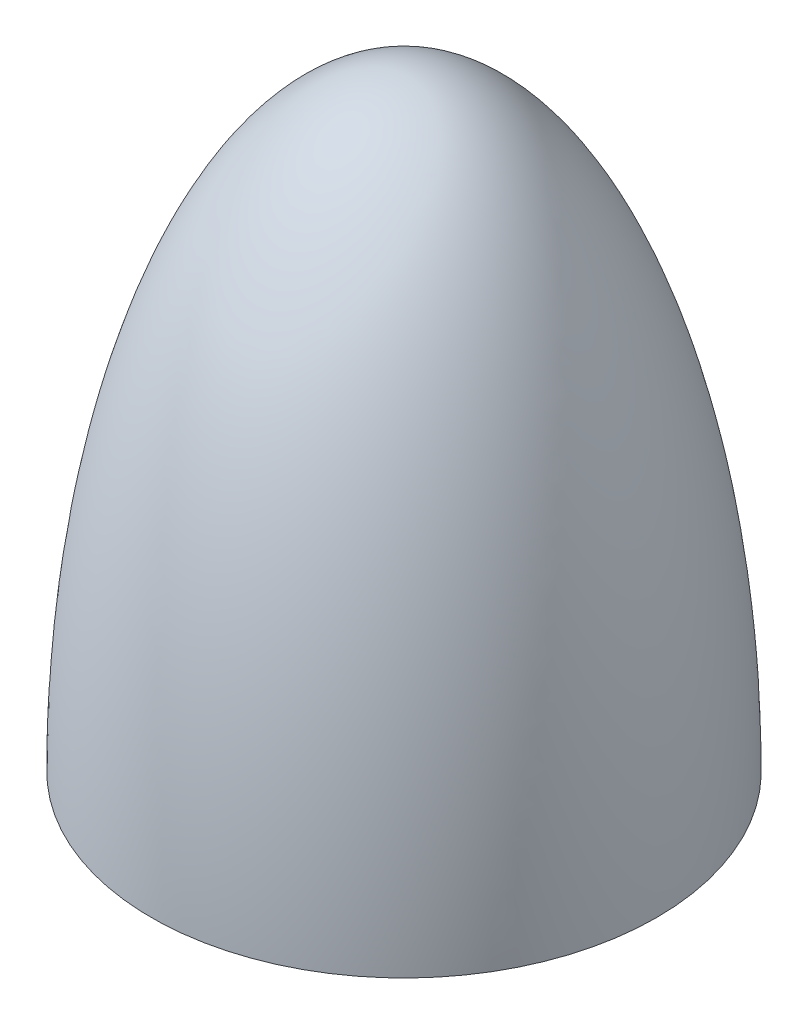
ISO-10303-21;
HEADER;
FILE_DESCRIPTION(('STEP AP214'),'2;1');
FILE_NAME('part.step','',(''),(''),'','','');
FILE_SCHEMA(('AUTOMOTIVE_DESIGN { 1 0 10303 214 1 1 1 1 }'));
ENDSEC;
DATA;
#1=APPLICATION_CONTEXT('core data for automotive mechanical design processes');
#2=APPLICATION_PROTOCOL_DEFINITION('international standard','automotive_design',2000,#1);
#3=PRODUCT_CONTEXT('',#1,'mechanical');
#4=PRODUCT('Part','Part','',(#3));
#5=PRODUCT_RELATED_PRODUCT_CATEGORY('part','',(#4));
#6=PRODUCT_DEFINITION_FORMATION('','',#4);
#7=PRODUCT_DEFINITION_CONTEXT('part definition',#1,'design');
#8=PRODUCT_DEFINITION('design','',#6,#7);
#9=PRODUCT_DEFINITION_SHAPE('','',#8);
#10=(LENGTH_UNIT() NAMED_UNIT(*) SI_UNIT(.MILLI.,.METRE.));
#11=(NAMED_UNIT(*) PLANE_ANGLE_UNIT() SI_UNIT($,.RADIAN.));
#12=(NAMED_UNIT(*) SI_UNIT($,.STERADIAN.) SOLID_ANGLE_UNIT());
#13=UNCERTAINTY_MEASURE_WITH_UNIT(LENGTH_MEASURE(1.E-05),#10,'distance_accuracy_value','');
#14=(GEOMETRIC_REPRESENTATION_CONTEXT(3) GLOBAL_UNCERTAINTY_ASSIGNED_CONTEXT((#13)) GLOBAL_UNIT_ASSIGNED_CONTEXT((#10,
#11,#12)) REPRESENTATION_CONTEXT('',''));
#15=CARTESIAN_POINT('',(0.,0.,0.));
#16=DIRECTION('',(0.,0.,1.));
#17=DIRECTION('',(1.,0.,0.));
#18=AXIS2_PLACEMENT_3D('',#15,#16,#17);
#19=CARTESIAN_POINT('',(0.,0.,0.));
#20=DIRECTION('',(0.,-1.,0.));
#21=DIRECTION('',(1.,0.,0.));
#22=AXIS2_PLACEMENT_3D('',#19,#20,#21);
#23=PLANE('',#22);
#24=CARTESIAN_POINT('',(0.,0.,0.));
#25=DIRECTION('',(0.,-1.,0.));
#26=DIRECTION('',(1.,0.,0.));
#27=AXIS2_PLACEMENT_3D('',#24,#25,#26);
#28=CIRCLE('',#27,60.9);
#29=CARTESIAN_POINT('',(60.9,0.,0.));
#30=VERTEX_POINT('',#29);
#31=EDGE_CURVE('E11',#30,#30,#28,.T.);
#32=ORIENTED_EDGE('',*,*,#31,.T.);
#33=EDGE_LOOP('',(#32));
#34=FACE_BOUND('',#33,.T.);
#35=CARTESIAN_POINT('',(0.,0.,0.));
#36=DIRECTION('',(0.,-1.,0.));
#37=DIRECTION('',(1.,0.,0.));
#38=AXIS2_PLACEMENT_3D('',#35,#36,#37);
#39=CIRCLE('',#38,59.7);
#40=CARTESIAN_POINT('',(59.7,0.,0.));
#41=VERTEX_POINT('',#40);
#42=EDGE_CURVE('E42',#41,#41,#39,.T.);
#43=ORIENTED_EDGE('',*,*,#42,.F.);
#44=EDGE_LOOP('',(#43));
#45=FACE_BOUND('',#44,.T.);
#46=ADVANCED_FACE('F35',(#34,#45),#23,.T.);
#47=CARTESIAN_POINT('',(60.9,0.,0.));
#48=CARTESIAN_POINT('',(60.9,18.9129795279416,0.));
#49=CARTESIAN_POINT('',(57.7820007855221,56.7389385838246,0.));
#50=CARTESIAN_POINT('',(46.6659786323963,96.8742574758897,0.));
#51=CARTESIAN_POINT('',(34.4131942072394,121.127388188883,0.));
#52=CARTESIAN_POINT('',(23.8677153846736,134.738684872233,0.));
#53=CARTESIAN_POINT('',(12.2820466005207,143.243228174329,0.));
#54=CARTESIAN_POINT('',(4.09401553350691,145.2,0.));
#55=CARTESIAN_POINT('',(0.,145.2,0.));
#56=B_SPLINE_CURVE_WITH_KNOTS('',3,(#47,#48,#49,#50,#51,#52,#53,#54,#55),.UNSPECIFIED.,.F.,.F.,
(4,1,1,1,1,1,4),(4.71238898038469,5.10508806208341,5.49778714378214,5.6941366846315,
5.89048622548086,6.08683576633022,6.28318530719433),.UNSPECIFIED.);
#57=CARTESIAN_POINT('',(0.,0.,0.));
#58=DIRECTION('',(0.,-1.,0.));
#59=AXIS1_PLACEMENT('',#57,#58);
#60=SURFACE_OF_REVOLUTION('',#56,#59);
#61=CARTESIAN_POINT('',(0.,145.2,0.));
#62=VERTEX_POINT('',#61);
#63=VERTEX_LOOP('',#62);
#64=FACE_BOUND('',#63,.T.);
#65=ORIENTED_EDGE('',*,*,#31,.F.);
#66=EDGE_LOOP('',(#65));
#67=FACE_BOUND('',#66,.T.);
#68=ADVANCED_FACE('F48',(#64,#67),#60,.F.);
#69=CARTESIAN_POINT('',(0.,0.,0.));
#70=DIRECTION('',(0.,0.,1.));
#71=DIRECTION('',(0.,1.,0.));
#72=AXIS2_PLACEMENT_3D('',#69,#70,#71);
#73=ELLIPSE('',#72,144.,59.7);
#74=TRIMMED_CURVE('',#73,(PARAMETER_VALUE(3.14159265358979)),
(PARAMETER_VALUE(6.28318530717959)),.T.,.PARAMETER.);
#75=CARTESIAN_POINT('',(0.,0.,0.));
#76=DIRECTION('',(0.,-1.,0.));
#77=AXIS1_PLACEMENT('',#75,#76);
#78=SURFACE_OF_REVOLUTION('',#74,#77);
#79=CARTESIAN_POINT('',(0.,144.,0.));
#80=VERTEX_POINT('',#79);
#81=VERTEX_LOOP('',#80);
#82=FACE_BOUND('',#81,.T.);
#83=ORIENTED_EDGE('',*,*,#42,.T.);
#84=EDGE_LOOP('',(#83));
#85=FACE_BOUND('',#84,.T.);
#86=ADVANCED_FACE('F51',(#82,#85),#78,.T.);
#87=CLOSED_SHELL('',(#46,#68,#86));
#88=MANIFOLD_SOLID_BREP('B2',#87);
#89=ADVANCED_BREP_SHAPE_REPRESENTATION('',(#18,#88),#14);
#90=SHAPE_DEFINITION_REPRESENTATION(#9,#89);
ENDSEC;
END-ISO-10303-21;
